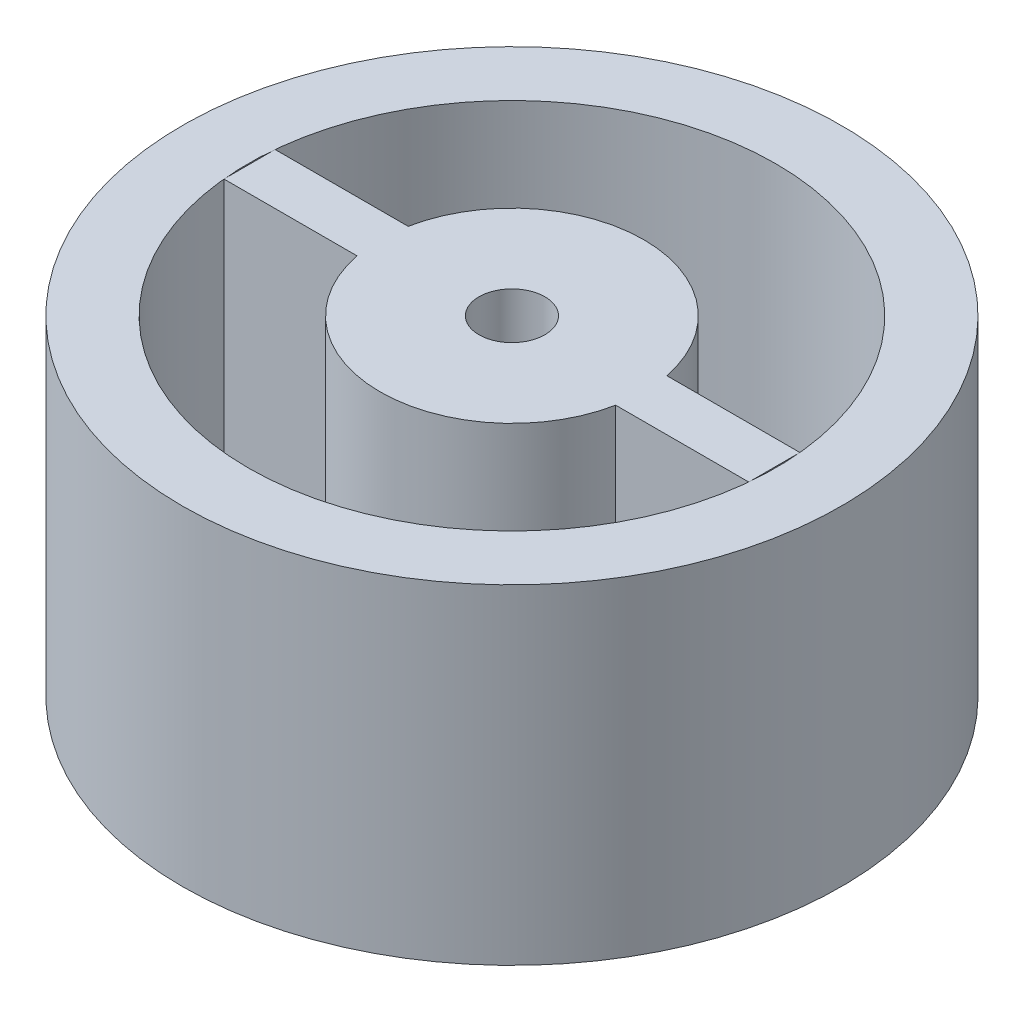
ISO-10303-21;
HEADER;
FILE_DESCRIPTION(('STEP AP214'),'2;1');
FILE_NAME('part.step','',(''),(''),'','','');
FILE_SCHEMA(('AUTOMOTIVE_DESIGN { 1 0 10303 214 1 1 1 1 }'));
ENDSEC;
DATA;
#1=APPLICATION_CONTEXT('core data for automotive mechanical design processes');
#2=APPLICATION_PROTOCOL_DEFINITION('international standard','automotive_design',2000,#1);
#3=PRODUCT_CONTEXT('',#1,'mechanical');
#4=PRODUCT('Part','Part','',(#3));
#5=PRODUCT_RELATED_PRODUCT_CATEGORY('part','',(#4));
#6=PRODUCT_DEFINITION_FORMATION('','',#4);
#7=PRODUCT_DEFINITION_CONTEXT('part definition',#1,'design');
#8=PRODUCT_DEFINITION('design','',#6,#7);
#9=PRODUCT_DEFINITION_SHAPE('','',#8);
#10=(LENGTH_UNIT() NAMED_UNIT(*) SI_UNIT(.MILLI.,.METRE.));
#11=(NAMED_UNIT(*) PLANE_ANGLE_UNIT() SI_UNIT($,.RADIAN.));
#12=(NAMED_UNIT(*) SI_UNIT($,.STERADIAN.) SOLID_ANGLE_UNIT());
#13=UNCERTAINTY_MEASURE_WITH_UNIT(LENGTH_MEASURE(1.E-05),#10,'distance_accuracy_value','');
#14=(GEOMETRIC_REPRESENTATION_CONTEXT(3) GLOBAL_UNCERTAINTY_ASSIGNED_CONTEXT((#13)) GLOBAL_UNIT_ASSIGNED_CONTEXT((#10,
#11,#12)) REPRESENTATION_CONTEXT('',''));
#15=CARTESIAN_POINT('',(0.,0.,0.));
#16=DIRECTION('',(0.,0.,1.));
#17=DIRECTION('',(1.,0.,0.));
#18=AXIS2_PLACEMENT_3D('',#15,#16,#17);
#19=CARTESIAN_POINT('',(0.,17.5,0.));
#20=DIRECTION('',(0.,1.,0.));
#21=DIRECTION('',(0.,0.,1.));
#22=AXIS2_PLACEMENT_3D('',#19,#20,#21);
#23=PLANE('',#22);
#24=CARTESIAN_POINT('',(0.,17.5,0.));
#25=DIRECTION('',(0.,-1.,0.));
#26=DIRECTION('',(0.,0.,-1.));
#27=AXIS2_PLACEMENT_3D('',#24,#25,#26);
#28=CIRCLE('',#27,24.);
#29=CARTESIAN_POINT('',(0.,17.5,-24.));
#30=VERTEX_POINT('',#29);
#31=EDGE_CURVE('E50',#30,#30,#28,.T.);
#32=ORIENTED_EDGE('',*,*,#31,.T.);
#33=EDGE_LOOP('',(#32));
#34=FACE_BOUND('',#33,.T.);
#35=CARTESIAN_POINT('',(0.,17.5,0.));
#36=DIRECTION('',(0.,1.,0.));
#37=DIRECTION('',(0.,0.,1.));
#38=AXIS2_PLACEMENT_3D('',#35,#36,#37);
#39=CIRCLE('',#38,30.);
#40=CARTESIAN_POINT('',(0.,17.5,30.));
#41=VERTEX_POINT('',#40);
#42=EDGE_CURVE('E61',#41,#41,#39,.T.);
#43=ORIENTED_EDGE('',*,*,#42,.T.);
#44=EDGE_LOOP('',(#43));
#45=FACE_BOUND('',#44,.T.);
#46=ADVANCED_FACE('F46',(#34,#45),#23,.T.);
#47=CARTESIAN_POINT('',(0.,-12.5,0.));
#48=DIRECTION('',(0.,1.,0.));
#49=DIRECTION('',(0.,0.,1.));
#50=AXIS2_PLACEMENT_3D('',#47,#48,#49);
#51=PLANE('',#50);
#52=CARTESIAN_POINT('',(0.,-12.5,0.));
#53=DIRECTION('',(0.,1.,0.));
#54=DIRECTION('',(0.,0.,1.));
#55=AXIS2_PLACEMENT_3D('',#52,#53,#54);
#56=CIRCLE('',#55,24.);
#57=CARTESIAN_POINT('',(0.,-12.5,24.));
#58=VERTEX_POINT('',#57);
#59=EDGE_CURVE('E55',#58,#58,#56,.T.);
#60=ORIENTED_EDGE('',*,*,#59,.T.);
#61=EDGE_LOOP('',(#60));
#62=FACE_BOUND('',#61,.T.);
#63=CARTESIAN_POINT('',(0.,-12.5,0.));
#64=DIRECTION('',(0.,1.,0.));
#65=DIRECTION('',(0.,0.,1.));
#66=AXIS2_PLACEMENT_3D('',#63,#64,#65);
#67=CIRCLE('',#66,30.);
#68=CARTESIAN_POINT('',(0.,-12.5,30.));
#69=VERTEX_POINT('',#68);
#70=EDGE_CURVE('E11',#69,#69,#67,.T.);
#71=ORIENTED_EDGE('',*,*,#70,.F.);
#72=EDGE_LOOP('',(#71));
#73=FACE_BOUND('',#72,.T.);
#74=ADVANCED_FACE('F48',(#62,#73),#51,.F.);
#75=CARTESIAN_POINT('',(0.,17.5,0.));
#76=DIRECTION('',(0.,-1.,0.));
#77=DIRECTION('',(0.,0.,-1.));
#78=AXIS2_PLACEMENT_3D('',#75,#76,#77);
#79=CYLINDRICAL_SURFACE('',#78,30.);
#80=ORIENTED_EDGE('',*,*,#42,.F.);
#81=EDGE_LOOP('',(#80));
#82=FACE_BOUND('',#81,.T.);
#83=ORIENTED_EDGE('',*,*,#70,.T.);
#84=EDGE_LOOP('',(#83));
#85=FACE_BOUND('',#84,.T.);
#86=ADVANCED_FACE('F75',(#82,#85),#79,.T.);
#87=CARTESIAN_POINT('',(0.,17.5,0.));
#88=DIRECTION('',(0.,-1.,0.));
#89=DIRECTION('',(0.,0.,-1.));
#90=AXIS2_PLACEMENT_3D('',#87,#88,#89);
#91=CYLINDRICAL_SURFACE('',#90,24.);
#92=ORIENTED_EDGE('',*,*,#31,.F.);
#93=EDGE_LOOP('',(#92));
#94=FACE_BOUND('',#93,.T.);
#95=ORIENTED_EDGE('',*,*,#59,.F.);
#96=EDGE_LOOP('',(#95));
#97=FACE_BOUND('',#96,.T.);
#98=ADVANCED_FACE('F72',(#94,#97),#91,.F.);
#99=CLOSED_SHELL('',(#46,#74,#86,#98));
#100=MANIFOLD_SOLID_BREP('B2',#99);
#101=CARTESIAN_POINT('',(0.,17.5,0.));
#102=DIRECTION('',(0.,-1.,0.));
#103=DIRECTION('',(0.,0.,-1.));
#104=AXIS2_PLACEMENT_3D('',#101,#102,#103);
#105=CYLINDRICAL_SURFACE('',#104,12.);
#106=DIRECTION('',(0.,-1.,0.));
#107=VECTOR('',#106,1.);
#108=CARTESIAN_POINT('',(11.7722849220192,17.5,-2.32665161010396));
#109=LINE('',#108,#107);
#110=CARTESIAN_POINT('',(11.7722849220192,-12.5,-2.32665161010396));
#111=VERTEX_POINT('',#110);
#112=CARTESIAN_POINT('',(11.7722849220192,17.5,-2.32665161010396));
#113=VERTEX_POINT('',#112);
#114=EDGE_CURVE('E44',#111,#113,#109,.F.);
#115=ORIENTED_EDGE('',*,*,#114,.F.);
#116=CARTESIAN_POINT('',(0.,-12.5,0.));
#117=DIRECTION('',(0.,1.,0.));
#118=DIRECTION('',(0.,0.,1.));
#119=AXIS2_PLACEMENT_3D('',#116,#117,#118);
#120=CIRCLE('',#119,12.);
#121=CARTESIAN_POINT('',(-11.7722849220192,-12.5,-2.32665161010396));
#122=VERTEX_POINT('',#121);
#123=EDGE_CURVE('E126',#111,#122,#120,.T.);
#124=ORIENTED_EDGE('',*,*,#123,.T.);
#125=DIRECTION('',(0.,-1.,0.));
#126=VECTOR('',#125,1.);
#127=CARTESIAN_POINT('',(-11.7722849220192,17.5,-2.32665161010396));
#128=LINE('',#127,#126);
#129=CARTESIAN_POINT('',(-11.7722849220192,17.5,-2.32665161010396));
#130=VERTEX_POINT('',#129);
#131=EDGE_CURVE('E119',#130,#122,#128,.T.);
#132=ORIENTED_EDGE('',*,*,#131,.F.);
#133=CARTESIAN_POINT('',(0.,17.5,0.));
#134=DIRECTION('',(0.,-1.,0.));
#135=DIRECTION('',(0.,0.,-1.));
#136=AXIS2_PLACEMENT_3D('',#133,#134,#135);
#137=CIRCLE('',#136,12.);
#138=EDGE_CURVE('E223',#130,#113,#137,.T.);
#139=ORIENTED_EDGE('',*,*,#138,.T.);
#140=EDGE_LOOP('',(#115,#124,#132,#139));
#141=FACE_BOUND('',#140,.T.);
#142=ADVANCED_FACE('F111',(#141),#105,.T.);
#143=CARTESIAN_POINT('',(0.,17.5,0.));
#144=DIRECTION('',(0.,1.,0.));
#145=DIRECTION('',(0.,0.,1.));
#146=AXIS2_PLACEMENT_3D('',#143,#144,#145);
#147=PLANE('',#146);
#148=CARTESIAN_POINT('',(0.,17.5,0.));
#149=DIRECTION('',(0.,1.,0.));
#150=DIRECTION('',(0.,0.,1.));
#151=AXIS2_PLACEMENT_3D('',#148,#149,#150);
#152=CIRCLE('',#151,3.);
#153=CARTESIAN_POINT('',(0.,17.5,3.));
#154=VERTEX_POINT('',#153);
#155=EDGE_CURVE('E229',#154,#154,#152,.T.);
#156=ORIENTED_EDGE('',*,*,#155,.F.);
#157=EDGE_LOOP('',(#156));
#158=FACE_BOUND('',#157,.T.);
#159=DIRECTION('',(-1.,0.,0.));
#160=VECTOR('',#159,1.);
#161=CARTESIAN_POINT('',(-23.8869565303996,17.5,2.32665161010396));
#162=LINE('',#161,#160);
#163=CARTESIAN_POINT('',(-11.7722849220192,17.5,2.32665161010396));
#164=VERTEX_POINT('',#163);
#165=CARTESIAN_POINT('',(-23.8869565303996,17.5,2.32665161010396));
#166=VERTEX_POINT('',#165);
#167=EDGE_CURVE('E198',#164,#166,#162,.T.);
#168=ORIENTED_EDGE('',*,*,#167,.F.);
#169=CARTESIAN_POINT('',(11.7722849220192,17.5,2.32665161010396));
#170=VERTEX_POINT('',#169);
#171=EDGE_CURVE('E196',#170,#164,#137,.T.);
#172=ORIENTED_EDGE('',*,*,#171,.F.);
#173=CARTESIAN_POINT('',(23.8869565303996,17.5,2.32665161010396));
#174=VERTEX_POINT('',#173);
#175=EDGE_CURVE('E179',#174,#170,#162,.T.);
#176=ORIENTED_EDGE('',*,*,#175,.F.);
#177=DIRECTION('',(0.,0.,1.));
#178=VECTOR('',#177,1.);
#179=CARTESIAN_POINT('',(23.8869565303996,17.5,-2.32665161010396));
#180=LINE('',#179,#178);
#181=CARTESIAN_POINT('',(23.8869565303996,17.5,-2.32665161010396));
#182=VERTEX_POINT('',#181);
#183=EDGE_CURVE('E195',#182,#174,#180,.T.);
#184=ORIENTED_EDGE('',*,*,#183,.F.);
#185=DIRECTION('',(1.,0.,0.));
#186=VECTOR('',#185,1.);
#187=CARTESIAN_POINT('',(-23.8869565303996,17.5,-2.32665161010396));
#188=LINE('',#187,#186);
#189=EDGE_CURVE('E212',#113,#182,#188,.T.);
#190=ORIENTED_EDGE('',*,*,#189,.F.);
#191=ORIENTED_EDGE('',*,*,#138,.F.);
#192=CARTESIAN_POINT('',(-23.8869565303996,17.5,-2.32665161010396));
#193=VERTEX_POINT('',#192);
#194=EDGE_CURVE('E187',#193,#130,#188,.T.);
#195=ORIENTED_EDGE('',*,*,#194,.F.);
#196=DIRECTION('',(0.,0.,-1.));
#197=VECTOR('',#196,1.);
#198=CARTESIAN_POINT('',(-23.8869565303996,17.5,-2.32665161010396));
#199=LINE('',#198,#197);
#200=EDGE_CURVE('E197',#166,#193,#199,.T.);
#201=ORIENTED_EDGE('',*,*,#200,.F.);
#202=EDGE_LOOP('',(#168,#172,#176,#184,#190,#191,#195,#201));
#203=FACE_BOUND('',#202,.T.);
#204=ADVANCED_FACE('F193',(#158,#203),#147,.T.);
#205=CARTESIAN_POINT('',(0.,17.5,0.));
#206=DIRECTION('',(0.,-1.,0.));
#207=DIRECTION('',(0.,0.,-1.));
#208=AXIS2_PLACEMENT_3D('',#205,#206,#207);
#209=CYLINDRICAL_SURFACE('',#208,3.);
#210=CARTESIAN_POINT('',(0.,-12.5,0.));
#211=DIRECTION('',(0.,1.,0.));
#212=DIRECTION('',(0.,0.,1.));
#213=AXIS2_PLACEMENT_3D('',#210,#211,#212);
#214=CIRCLE('',#213,3.);
#215=CARTESIAN_POINT('',(0.,-12.5,3.));
#216=VERTEX_POINT('',#215);
#217=EDGE_CURVE('E233',#216,#216,#214,.T.);
#218=ORIENTED_EDGE('',*,*,#217,.F.);
#219=EDGE_LOOP('',(#218));
#220=FACE_BOUND('',#219,.T.);
#221=ORIENTED_EDGE('',*,*,#155,.T.);
#222=EDGE_LOOP('',(#221));
#223=FACE_BOUND('',#222,.T.);
#224=ADVANCED_FACE('F272',(#220,#223),#209,.F.);
#225=CARTESIAN_POINT('',(0.,-12.5,0.));
#226=DIRECTION('',(0.,1.,0.));
#227=DIRECTION('',(0.,0.,1.));
#228=AXIS2_PLACEMENT_3D('',#225,#226,#227);
#229=PLANE('',#228);
#230=ORIENTED_EDGE('',*,*,#217,.T.);
#231=EDGE_LOOP('',(#230));
#232=FACE_BOUND('',#231,.T.);
#233=CARTESIAN_POINT('',(-11.7722849220192,-12.5,2.32665161010396));
#234=VERTEX_POINT('',#233);
#235=CARTESIAN_POINT('',(11.7722849220192,-12.5,2.32665161010396));
#236=VERTEX_POINT('',#235);
#237=EDGE_CURVE('E134',#234,#236,#120,.T.);
#238=ORIENTED_EDGE('',*,*,#237,.F.);
#239=DIRECTION('',(-1.,0.,0.));
#240=VECTOR('',#239,1.);
#241=CARTESIAN_POINT('',(-23.8869565303996,-12.5,2.32665161010396));
#242=LINE('',#241,#240);
#243=CARTESIAN_POINT('',(-23.8869565303996,-12.5,2.32665161010396));
#244=VERTEX_POINT('',#243);
#245=EDGE_CURVE('E217',#234,#244,#242,.T.);
#246=ORIENTED_EDGE('',*,*,#245,.T.);
#247=DIRECTION('',(0.,0.,-1.));
#248=VECTOR('',#247,1.);
#249=CARTESIAN_POINT('',(-23.8869565303996,-12.5,-2.32665161010396));
#250=LINE('',#249,#248);
#251=CARTESIAN_POINT('',(-23.8869565303996,-12.5,-2.32665161010396));
#252=VERTEX_POINT('',#251);
#253=EDGE_CURVE('E219',#244,#252,#250,.T.);
#254=ORIENTED_EDGE('',*,*,#253,.T.);
#255=DIRECTION('',(1.,0.,0.));
#256=VECTOR('',#255,1.);
#257=CARTESIAN_POINT('',(-23.8869565303996,-12.5,-2.32665161010396));
#258=LINE('',#257,#256);
#259=EDGE_CURVE('E204',#252,#122,#258,.T.);
#260=ORIENTED_EDGE('',*,*,#259,.T.);
#261=ORIENTED_EDGE('',*,*,#123,.F.);
#262=CARTESIAN_POINT('',(23.8869565303996,-12.5,-2.32665161010396));
#263=VERTEX_POINT('',#262);
#264=EDGE_CURVE('E207',#111,#263,#258,.T.);
#265=ORIENTED_EDGE('',*,*,#264,.T.);
#266=DIRECTION('',(0.,0.,1.));
#267=VECTOR('',#266,1.);
#268=CARTESIAN_POINT('',(23.8869565303996,-12.5,-2.32665161010396));
#269=LINE('',#268,#267);
#270=CARTESIAN_POINT('',(23.8869565303996,-12.5,2.32665161010396));
#271=VERTEX_POINT('',#270);
#272=EDGE_CURVE('E215',#263,#271,#269,.T.);
#273=ORIENTED_EDGE('',*,*,#272,.T.);
#274=EDGE_CURVE('E181',#271,#236,#242,.T.);
#275=ORIENTED_EDGE('',*,*,#274,.T.);
#276=EDGE_LOOP('',(#238,#246,#254,#260,#261,#265,#273,#275));
#277=FACE_BOUND('',#276,.T.);
#278=ADVANCED_FACE('F113',(#232,#277),#229,.F.);
#279=DIRECTION('',(0.,-1.,0.));
#280=VECTOR('',#279,1.);
#281=CARTESIAN_POINT('',(-11.7722849220192,17.5,2.32665161010396));
#282=LINE('',#281,#280);
#283=EDGE_CURVE('E238',#234,#164,#282,.F.);
#284=ORIENTED_EDGE('',*,*,#283,.F.);
#285=ORIENTED_EDGE('',*,*,#237,.T.);
#286=DIRECTION('',(0.,-1.,0.));
#287=VECTOR('',#286,1.);
#288=CARTESIAN_POINT('',(11.7722849220192,17.5,2.32665161010396));
#289=LINE('',#288,#287);
#290=EDGE_CURVE('E232',#170,#236,#289,.T.);
#291=ORIENTED_EDGE('',*,*,#290,.F.);
#292=ORIENTED_EDGE('',*,*,#171,.T.);
#293=EDGE_LOOP('',(#284,#285,#291,#292));
#294=FACE_BOUND('',#293,.T.);
#295=ADVANCED_FACE('F255',(#294),#105,.T.);
#296=CARTESIAN_POINT('',(23.8869565303996,17.5,-2.32665161010396));
#297=DIRECTION('',(1.,0.,0.));
#298=DIRECTION('',(0.,0.,-1.));
#299=AXIS2_PLACEMENT_3D('',#296,#297,#298);
#300=PLANE('',#299);
#301=ORIENTED_EDGE('',*,*,#272,.F.);
#302=DIRECTION('',(0.,-1.,0.));
#303=VECTOR('',#302,1.);
#304=CARTESIAN_POINT('',(23.8869565303996,17.5,-2.32665161010396));
#305=LINE('',#304,#303);
#306=EDGE_CURVE('E203',#182,#263,#305,.T.);
#307=ORIENTED_EDGE('',*,*,#306,.F.);
#308=ORIENTED_EDGE('',*,*,#183,.T.);
#309=DIRECTION('',(0.,-1.,0.));
#310=VECTOR('',#309,1.);
#311=CARTESIAN_POINT('',(23.8869565303996,17.5,2.32665161010396));
#312=LINE('',#311,#310);
#313=EDGE_CURVE('E176',#174,#271,#312,.T.);
#314=ORIENTED_EDGE('',*,*,#313,.T.);
#315=EDGE_LOOP('',(#301,#307,#308,#314));
#316=FACE_BOUND('',#315,.T.);
#317=ADVANCED_FACE('F201',(#316),#300,.T.);
#318=CARTESIAN_POINT('',(-23.8869565303996,17.5,2.32665161010396));
#319=DIRECTION('',(0.,0.,1.));
#320=DIRECTION('',(1.,0.,0.));
#321=AXIS2_PLACEMENT_3D('',#318,#319,#320);
#322=PLANE('',#321);
#323=ORIENTED_EDGE('',*,*,#175,.T.);
#324=ORIENTED_EDGE('',*,*,#290,.T.);
#325=ORIENTED_EDGE('',*,*,#274,.F.);
#326=ORIENTED_EDGE('',*,*,#313,.F.);
#327=EDGE_LOOP('',(#323,#324,#325,#326));
#328=FACE_BOUND('',#327,.T.);
#329=ADVANCED_FACE('F178',(#328),#322,.T.);
#330=CARTESIAN_POINT('',(-23.8869565303996,17.5,-2.32665161010396));
#331=DIRECTION('',(0.,0.,-1.));
#332=DIRECTION('',(-1.,0.,0.));
#333=AXIS2_PLACEMENT_3D('',#330,#331,#332);
#334=PLANE('',#333);
#335=ORIENTED_EDGE('',*,*,#264,.F.);
#336=ORIENTED_EDGE('',*,*,#114,.T.);
#337=ORIENTED_EDGE('',*,*,#189,.T.);
#338=ORIENTED_EDGE('',*,*,#306,.T.);
#339=EDGE_LOOP('',(#335,#336,#337,#338));
#340=FACE_BOUND('',#339,.T.);
#341=ADVANCED_FACE('F254',(#340),#334,.T.);
#342=CARTESIAN_POINT('',(-23.8869565303996,17.5,-2.32665161010396));
#343=DIRECTION('',(-1.,0.,0.));
#344=DIRECTION('',(0.,0.,1.));
#345=AXIS2_PLACEMENT_3D('',#342,#343,#344);
#346=PLANE('',#345);
#347=ORIENTED_EDGE('',*,*,#253,.F.);
#348=DIRECTION('',(0.,-1.,0.));
#349=VECTOR('',#348,1.);
#350=CARTESIAN_POINT('',(-23.8869565303996,17.5,2.32665161010396));
#351=LINE('',#350,#349);
#352=EDGE_CURVE('E186',#166,#244,#351,.T.);
#353=ORIENTED_EDGE('',*,*,#352,.F.);
#354=ORIENTED_EDGE('',*,*,#200,.T.);
#355=DIRECTION('',(0.,-1.,0.));
#356=VECTOR('',#355,1.);
#357=CARTESIAN_POINT('',(-23.8869565303996,17.5,-2.32665161010396));
#358=LINE('',#357,#356);
#359=EDGE_CURVE('E224',#193,#252,#358,.T.);
#360=ORIENTED_EDGE('',*,*,#359,.T.);
#361=EDGE_LOOP('',(#347,#353,#354,#360));
#362=FACE_BOUND('',#361,.T.);
#363=ADVANCED_FACE('F250',(#362),#346,.T.);
#364=ORIENTED_EDGE('',*,*,#194,.T.);
#365=ORIENTED_EDGE('',*,*,#131,.T.);
#366=ORIENTED_EDGE('',*,*,#259,.F.);
#367=ORIENTED_EDGE('',*,*,#359,.F.);
#368=EDGE_LOOP('',(#364,#365,#366,#367));
#369=FACE_BOUND('',#368,.T.);
#370=ADVANCED_FACE('F242',(#369),#334,.T.);
#371=ORIENTED_EDGE('',*,*,#245,.F.);
#372=ORIENTED_EDGE('',*,*,#283,.T.);
#373=ORIENTED_EDGE('',*,*,#167,.T.);
#374=ORIENTED_EDGE('',*,*,#352,.T.);
#375=EDGE_LOOP('',(#371,#372,#373,#374));
#376=FACE_BOUND('',#375,.T.);
#377=ADVANCED_FACE('F257',(#376),#322,.T.);
#378=CLOSED_SHELL('',(#142,#204,#224,#278,#295,#317,#329,#341,#363,#370,#377));
#379=MANIFOLD_SOLID_BREP('B6',#378);
#380=ADVANCED_BREP_SHAPE_REPRESENTATION('',(#18,#100,#379),#14);
#381=SHAPE_DEFINITION_REPRESENTATION(#9,#380);
ENDSEC;
END-ISO-10303-21;
